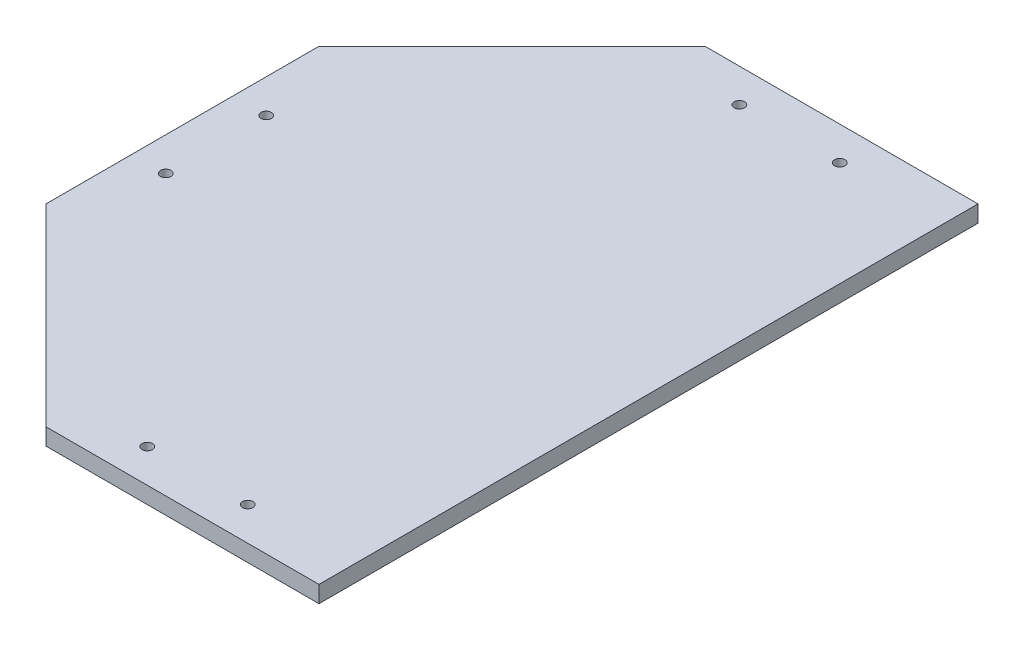
ISO-10303-21;
HEADER;
FILE_DESCRIPTION(('STEP AP214'),'2;1');
FILE_NAME('part.step','',(''),(''),'','','');
FILE_SCHEMA(('AUTOMOTIVE_DESIGN { 1 0 10303 214 1 1 1 1 }'));
ENDSEC;
DATA;
#1=APPLICATION_CONTEXT('core data for automotive mechanical design processes');
#2=APPLICATION_PROTOCOL_DEFINITION('international standard','automotive_design',2000,#1);
#3=PRODUCT_CONTEXT('',#1,'mechanical');
#4=PRODUCT('Part','Part','',(#3));
#5=PRODUCT_RELATED_PRODUCT_CATEGORY('part','',(#4));
#6=PRODUCT_DEFINITION_FORMATION('','',#4);
#7=PRODUCT_DEFINITION_CONTEXT('part definition',#1,'design');
#8=PRODUCT_DEFINITION('design','',#6,#7);
#9=PRODUCT_DEFINITION_SHAPE('','',#8);
#10=(LENGTH_UNIT() NAMED_UNIT(*) SI_UNIT(.MILLI.,.METRE.));
#11=(NAMED_UNIT(*) PLANE_ANGLE_UNIT() SI_UNIT($,.RADIAN.));
#12=(NAMED_UNIT(*) SI_UNIT($,.STERADIAN.) SOLID_ANGLE_UNIT());
#13=UNCERTAINTY_MEASURE_WITH_UNIT(LENGTH_MEASURE(1.E-05),#10,'distance_accuracy_value','');
#14=(GEOMETRIC_REPRESENTATION_CONTEXT(3) GLOBAL_UNCERTAINTY_ASSIGNED_CONTEXT((#13)) GLOBAL_UNIT_ASSIGNED_CONTEXT((#10,
#11,#12)) REPRESENTATION_CONTEXT('',''));
#15=CARTESIAN_POINT('',(0.,0.,0.));
#16=DIRECTION('',(0.,0.,1.));
#17=DIRECTION('',(1.,0.,0.));
#18=AXIS2_PLACEMENT_3D('',#15,#16,#17);
#19=CARTESIAN_POINT('',(51.7766952966369,6.35,-125.));
#20=DIRECTION('',(0.,0.,1.));
#21=DIRECTION('',(1.,0.,0.));
#22=AXIS2_PLACEMENT_3D('',#19,#20,#21);
#23=PLANE('',#22);
#24=DIRECTION('',(-1.,0.,0.));
#25=VECTOR('',#24,1.);
#26=CARTESIAN_POINT('',(51.7766952966369,0.,-125.));
#27=LINE('',#26,#25);
#28=CARTESIAN_POINT('',(51.7766952966369,0.,-125.));
#29=VERTEX_POINT('',#28);
#30=CARTESIAN_POINT('',(-51.7766952966369,0.,-125.));
#31=VERTEX_POINT('',#30);
#32=EDGE_CURVE('E121',#29,#31,#27,.T.);
#33=ORIENTED_EDGE('',*,*,#32,.T.);
#34=DIRECTION('',(0.,-1.,0.));
#35=VECTOR('',#34,1.);
#36=CARTESIAN_POINT('',(-51.7766952966369,6.35,-125.));
#37=LINE('',#36,#35);
#38=CARTESIAN_POINT('',(-51.7766952966369,6.35,-125.));
#39=VERTEX_POINT('',#38);
#40=EDGE_CURVE('E117',#39,#31,#37,.T.);
#41=ORIENTED_EDGE('',*,*,#40,.F.);
#42=DIRECTION('',(-1.,0.,0.));
#43=VECTOR('',#42,1.);
#44=CARTESIAN_POINT('',(51.7766952966369,6.35,-125.));
#45=LINE('',#44,#43);
#46=CARTESIAN_POINT('',(51.7766952966369,6.35,-125.));
#47=VERTEX_POINT('',#46);
#48=EDGE_CURVE('E83',#47,#39,#45,.T.);
#49=ORIENTED_EDGE('',*,*,#48,.F.);
#50=DIRECTION('',(0.,-1.,0.));
#51=VECTOR('',#50,1.);
#52=CARTESIAN_POINT('',(51.7766952966369,6.35,-125.));
#53=LINE('',#52,#51);
#54=EDGE_CURVE('E41',#47,#29,#53,.T.);
#55=ORIENTED_EDGE('',*,*,#54,.T.);
#56=EDGE_LOOP('',(#33,#41,#49,#55));
#57=FACE_BOUND('',#56,.T.);
#58=ADVANCED_FACE('F33',(#57),#23,.F.);
#59=CARTESIAN_POINT('',(-51.7766952966369,6.35,-125.));
#60=DIRECTION('',(0.707106781186547,0.,0.707106781186548));
#61=DIRECTION('',(0.707106781186548,0.,-0.707106781186547));
#62=AXIS2_PLACEMENT_3D('',#59,#60,#61);
#63=PLANE('',#62);
#64=DIRECTION('',(-0.707106781186548,0.,0.707106781186547));
#65=VECTOR('',#64,1.);
#66=CARTESIAN_POINT('',(-51.7766952966369,0.,-125.));
#67=LINE('',#66,#65);
#68=CARTESIAN_POINT('',(-125.,0.,-51.7766952966369));
#69=VERTEX_POINT('',#68);
#70=EDGE_CURVE('E126',#31,#69,#67,.T.);
#71=ORIENTED_EDGE('',*,*,#70,.T.);
#72=DIRECTION('',(0.,-1.,0.));
#73=VECTOR('',#72,1.);
#74=CARTESIAN_POINT('',(-125.,6.35,-51.7766952966369));
#75=LINE('',#74,#73);
#76=CARTESIAN_POINT('',(-125.,6.35,-51.7766952966369));
#77=VERTEX_POINT('',#76);
#78=EDGE_CURVE('E114',#77,#69,#75,.T.);
#79=ORIENTED_EDGE('',*,*,#78,.F.);
#80=DIRECTION('',(-0.707106781186548,0.,0.707106781186547));
#81=VECTOR('',#80,1.);
#82=CARTESIAN_POINT('',(-51.7766952966369,6.35,-125.));
#83=LINE('',#82,#81);
#84=EDGE_CURVE('E136',#39,#77,#83,.T.);
#85=ORIENTED_EDGE('',*,*,#84,.F.);
#86=ORIENTED_EDGE('',*,*,#40,.T.);
#87=EDGE_LOOP('',(#71,#79,#85,#86));
#88=FACE_BOUND('',#87,.T.);
#89=ADVANCED_FACE('F156',(#88),#63,.F.);
#90=CARTESIAN_POINT('',(-125.,6.35,-51.7766952966369));
#91=DIRECTION('',(1.,0.,0.));
#92=DIRECTION('',(0.,0.,-1.));
#93=AXIS2_PLACEMENT_3D('',#90,#91,#92);
#94=PLANE('',#93);
#95=DIRECTION('',(0.,0.,1.));
#96=VECTOR('',#95,1.);
#97=CARTESIAN_POINT('',(-125.,0.,-51.7766952966369));
#98=LINE('',#97,#96);
#99=CARTESIAN_POINT('',(-125.,0.,51.7766952966369));
#100=VERTEX_POINT('',#99);
#101=EDGE_CURVE('E129',#69,#100,#98,.T.);
#102=ORIENTED_EDGE('',*,*,#101,.T.);
#103=DIRECTION('',(0.,-1.,0.));
#104=VECTOR('',#103,1.);
#105=CARTESIAN_POINT('',(-125.,6.35,51.7766952966369));
#106=LINE('',#105,#104);
#107=CARTESIAN_POINT('',(-125.,6.35,51.7766952966369));
#108=VERTEX_POINT('',#107);
#109=EDGE_CURVE('E108',#108,#100,#106,.T.);
#110=ORIENTED_EDGE('',*,*,#109,.F.);
#111=DIRECTION('',(0.,0.,1.));
#112=VECTOR('',#111,1.);
#113=CARTESIAN_POINT('',(-125.,6.35,-51.7766952966369));
#114=LINE('',#113,#112);
#115=EDGE_CURVE('E138',#77,#108,#114,.T.);
#116=ORIENTED_EDGE('',*,*,#115,.F.);
#117=ORIENTED_EDGE('',*,*,#78,.T.);
#118=EDGE_LOOP('',(#102,#110,#116,#117));
#119=FACE_BOUND('',#118,.T.);
#120=ADVANCED_FACE('F147',(#119),#94,.F.);
#121=CARTESIAN_POINT('',(-125.,6.35,51.7766952966369));
#122=DIRECTION('',(0.707106781186548,0.,-0.707106781186548));
#123=DIRECTION('',(-0.707106781186548,0.,-0.707106781186548));
#124=AXIS2_PLACEMENT_3D('',#121,#122,#123);
#125=PLANE('',#124);
#126=DIRECTION('',(0.707106781186547,0.,0.707106781186547));
#127=VECTOR('',#126,1.);
#128=CARTESIAN_POINT('',(-125.,0.,51.7766952966369));
#129=LINE('',#128,#127);
#130=CARTESIAN_POINT('',(-51.7766952966368,0.,125.));
#131=VERTEX_POINT('',#130);
#132=EDGE_CURVE('E69',#100,#131,#129,.T.);
#133=ORIENTED_EDGE('',*,*,#132,.T.);
#134=DIRECTION('',(0.,-1.,0.));
#135=VECTOR('',#134,1.);
#136=CARTESIAN_POINT('',(-51.7766952966368,6.35,125.));
#137=LINE('',#136,#135);
#138=CARTESIAN_POINT('',(-51.7766952966368,6.35,125.));
#139=VERTEX_POINT('',#138);
#140=EDGE_CURVE('E106',#139,#131,#137,.T.);
#141=ORIENTED_EDGE('',*,*,#140,.F.);
#142=DIRECTION('',(0.707106781186547,0.,0.707106781186547));
#143=VECTOR('',#142,1.);
#144=CARTESIAN_POINT('',(-125.,6.35,51.7766952966369));
#145=LINE('',#144,#143);
#146=EDGE_CURVE('E49',#108,#139,#145,.T.);
#147=ORIENTED_EDGE('',*,*,#146,.F.);
#148=ORIENTED_EDGE('',*,*,#109,.T.);
#149=EDGE_LOOP('',(#133,#141,#147,#148));
#150=FACE_BOUND('',#149,.T.);
#151=ADVANCED_FACE('F148',(#150),#125,.F.);
#152=CARTESIAN_POINT('',(-51.7766952966368,6.35,125.));
#153=DIRECTION('',(0.,0.,-1.));
#154=DIRECTION('',(-1.,0.,0.));
#155=AXIS2_PLACEMENT_3D('',#152,#153,#154);
#156=PLANE('',#155);
#157=DIRECTION('',(1.,0.,0.));
#158=VECTOR('',#157,1.);
#159=CARTESIAN_POINT('',(-51.7766952966368,0.,125.));
#160=LINE('',#159,#158);
#161=CARTESIAN_POINT('',(51.7766952966369,0.,125.));
#162=VERTEX_POINT('',#161);
#163=EDGE_CURVE('E105',#131,#162,#160,.T.);
#164=ORIENTED_EDGE('',*,*,#163,.T.);
#165=DIRECTION('',(0.,-1.,0.));
#166=VECTOR('',#165,1.);
#167=CARTESIAN_POINT('',(51.7766952966369,6.35,125.));
#168=LINE('',#167,#166);
#169=CARTESIAN_POINT('',(51.7766952966369,6.35,125.));
#170=VERTEX_POINT('',#169);
#171=EDGE_CURVE('E77',#170,#162,#168,.T.);
#172=ORIENTED_EDGE('',*,*,#171,.F.);
#173=DIRECTION('',(1.,0.,0.));
#174=VECTOR('',#173,1.);
#175=CARTESIAN_POINT('',(-51.7766952966368,6.35,125.));
#176=LINE('',#175,#174);
#177=EDGE_CURVE('E97',#139,#170,#176,.T.);
#178=ORIENTED_EDGE('',*,*,#177,.F.);
#179=ORIENTED_EDGE('',*,*,#140,.T.);
#180=EDGE_LOOP('',(#164,#172,#178,#179));
#181=FACE_BOUND('',#180,.T.);
#182=ADVANCED_FACE('F103',(#181),#156,.F.);
#183=CARTESIAN_POINT('',(0.,6.35,0.));
#184=DIRECTION('',(0.,1.,0.));
#185=DIRECTION('',(0.,0.,1.));
#186=AXIS2_PLACEMENT_3D('',#183,#184,#185);
#187=PLANE('',#186);
#188=DIRECTION('',(0.,0.,1.));
#189=VECTOR('',#188,1.);
#190=CARTESIAN_POINT('',(51.7766952966369,6.35,-125.));
#191=LINE('',#190,#189);
#192=EDGE_CURVE('E91',#47,#170,#191,.T.);
#193=ORIENTED_EDGE('',*,*,#192,.F.);
#194=ORIENTED_EDGE('',*,*,#48,.T.);
#195=ORIENTED_EDGE('',*,*,#84,.T.);
#196=ORIENTED_EDGE('',*,*,#115,.T.);
#197=ORIENTED_EDGE('',*,*,#146,.T.);
#198=ORIENTED_EDGE('',*,*,#177,.T.);
#199=EDGE_LOOP('',(#193,#194,#195,#196,#197,#198));
#200=FACE_BOUND('',#199,.T.);
#201=CARTESIAN_POINT('',(-112.3,6.35,-19.05));
#202=DIRECTION('',(0.,1.,0.));
#203=DIRECTION('',(0.,0.,1.));
#204=AXIS2_PLACEMENT_3D('',#201,#202,#203);
#205=CIRCLE('',#204,1.99499999999999);
#206=CARTESIAN_POINT('',(-112.3,6.35,-17.055));
#207=VERTEX_POINT('',#206);
#208=EDGE_CURVE('E313',#207,#207,#205,.T.);
#209=ORIENTED_EDGE('',*,*,#208,.F.);
#210=EDGE_LOOP('',(#209));
#211=FACE_BOUND('',#210,.T.);
#212=CARTESIAN_POINT('',(-112.3,6.35,19.05));
#213=DIRECTION('',(0.,1.,0.));
#214=DIRECTION('',(0.,0.,1.));
#215=AXIS2_PLACEMENT_3D('',#212,#213,#214);
#216=CIRCLE('',#215,1.99499999999999);
#217=CARTESIAN_POINT('',(-112.3,6.35,21.045));
#218=VERTEX_POINT('',#217);
#219=EDGE_CURVE('E94',#218,#218,#216,.T.);
#220=ORIENTED_EDGE('',*,*,#219,.F.);
#221=EDGE_LOOP('',(#220));
#222=FACE_BOUND('',#221,.T.);
#223=CARTESIAN_POINT('',(-26.05,6.35,-112.3));
#224=DIRECTION('',(0.,1.,0.));
#225=DIRECTION('',(0.,0.,-1.));
#226=AXIS2_PLACEMENT_3D('',#223,#224,#225);
#227=CIRCLE('',#226,1.99499999999999);
#228=CARTESIAN_POINT('',(-26.05,6.35,-114.295));
#229=VERTEX_POINT('',#228);
#230=EDGE_CURVE('E309',#229,#229,#227,.T.);
#231=ORIENTED_EDGE('',*,*,#230,.F.);
#232=EDGE_LOOP('',(#231));
#233=FACE_BOUND('',#232,.T.);
#234=CARTESIAN_POINT('',(12.05,6.35,-112.3));
#235=DIRECTION('',(0.,1.,0.));
#236=DIRECTION('',(0.,0.,-1.));
#237=AXIS2_PLACEMENT_3D('',#234,#235,#236);
#238=CIRCLE('',#237,1.995);
#239=CARTESIAN_POINT('',(12.05,6.35,-114.295));
#240=VERTEX_POINT('',#239);
#241=EDGE_CURVE('E305',#240,#240,#238,.T.);
#242=ORIENTED_EDGE('',*,*,#241,.F.);
#243=EDGE_LOOP('',(#242));
#244=FACE_BOUND('',#243,.T.);
#245=CARTESIAN_POINT('',(12.05,6.35,112.3));
#246=DIRECTION('',(0.,1.,0.));
#247=DIRECTION('',(0.,0.,1.));
#248=AXIS2_PLACEMENT_3D('',#245,#246,#247);
#249=CIRCLE('',#248,1.995);
#250=CARTESIAN_POINT('',(12.05,6.35,114.295));
#251=VERTEX_POINT('',#250);
#252=EDGE_CURVE('E297',#251,#251,#249,.T.);
#253=ORIENTED_EDGE('',*,*,#252,.F.);
#254=EDGE_LOOP('',(#253));
#255=FACE_BOUND('',#254,.T.);
#256=CARTESIAN_POINT('',(-26.05,6.35,112.3));
#257=DIRECTION('',(0.,1.,0.));
#258=DIRECTION('',(0.,0.,1.));
#259=AXIS2_PLACEMENT_3D('',#256,#257,#258);
#260=CIRCLE('',#259,1.995);
#261=CARTESIAN_POINT('',(-26.05,6.35,114.295));
#262=VERTEX_POINT('',#261);
#263=EDGE_CURVE('E132',#262,#262,#260,.T.);
#264=ORIENTED_EDGE('',*,*,#263,.F.);
#265=EDGE_LOOP('',(#264));
#266=FACE_BOUND('',#265,.T.);
#267=ADVANCED_FACE('F98',(#200,#211,#222,#233,#244,#255,#266),#187,.T.);
#268=CARTESIAN_POINT('',(0.,0.,0.));
#269=DIRECTION('',(0.,1.,0.));
#270=DIRECTION('',(0.,0.,1.));
#271=AXIS2_PLACEMENT_3D('',#268,#269,#270);
#272=PLANE('',#271);
#273=CARTESIAN_POINT('',(-112.3,0.,-19.05));
#274=DIRECTION('',(0.,1.,0.));
#275=DIRECTION('',(0.,0.,1.));
#276=AXIS2_PLACEMENT_3D('',#273,#274,#275);
#277=CIRCLE('',#276,1.99499999999999);
#278=CARTESIAN_POINT('',(-112.3,0.,-17.055));
#279=VERTEX_POINT('',#278);
#280=EDGE_CURVE('E275',#279,#279,#277,.T.);
#281=ORIENTED_EDGE('',*,*,#280,.T.);
#282=EDGE_LOOP('',(#281));
#283=FACE_BOUND('',#282,.T.);
#284=CARTESIAN_POINT('',(-112.3,0.,19.05));
#285=DIRECTION('',(0.,1.,0.));
#286=DIRECTION('',(0.,0.,1.));
#287=AXIS2_PLACEMENT_3D('',#284,#285,#286);
#288=CIRCLE('',#287,1.99499999999999);
#289=CARTESIAN_POINT('',(-112.3,0.,21.045));
#290=VERTEX_POINT('',#289);
#291=EDGE_CURVE('E279',#290,#290,#288,.T.);
#292=ORIENTED_EDGE('',*,*,#291,.T.);
#293=EDGE_LOOP('',(#292));
#294=FACE_BOUND('',#293,.T.);
#295=CARTESIAN_POINT('',(-26.05,0.,-112.3));
#296=DIRECTION('',(0.,1.,0.));
#297=DIRECTION('',(0.,0.,-1.));
#298=AXIS2_PLACEMENT_3D('',#295,#296,#297);
#299=CIRCLE('',#298,1.99499999999999);
#300=CARTESIAN_POINT('',(-26.05,0.,-114.295));
#301=VERTEX_POINT('',#300);
#302=EDGE_CURVE('E283',#301,#301,#299,.T.);
#303=ORIENTED_EDGE('',*,*,#302,.T.);
#304=EDGE_LOOP('',(#303));
#305=FACE_BOUND('',#304,.T.);
#306=CARTESIAN_POINT('',(12.05,0.,-112.3));
#307=DIRECTION('',(0.,1.,0.));
#308=DIRECTION('',(0.,0.,-1.));
#309=AXIS2_PLACEMENT_3D('',#306,#307,#308);
#310=CIRCLE('',#309,1.995);
#311=CARTESIAN_POINT('',(12.05,0.,-114.295));
#312=VERTEX_POINT('',#311);
#313=EDGE_CURVE('E287',#312,#312,#310,.T.);
#314=ORIENTED_EDGE('',*,*,#313,.T.);
#315=EDGE_LOOP('',(#314));
#316=FACE_BOUND('',#315,.T.);
#317=CARTESIAN_POINT('',(12.05,0.,112.3));
#318=DIRECTION('',(0.,1.,0.));
#319=DIRECTION('',(0.,0.,1.));
#320=AXIS2_PLACEMENT_3D('',#317,#318,#319);
#321=CIRCLE('',#320,1.995);
#322=CARTESIAN_POINT('',(12.05,0.,114.295));
#323=VERTEX_POINT('',#322);
#324=EDGE_CURVE('E291',#323,#323,#321,.T.);
#325=ORIENTED_EDGE('',*,*,#324,.T.);
#326=EDGE_LOOP('',(#325));
#327=FACE_BOUND('',#326,.T.);
#328=CARTESIAN_POINT('',(-26.05,0.,112.3));
#329=DIRECTION('',(0.,1.,0.));
#330=DIRECTION('',(0.,0.,1.));
#331=AXIS2_PLACEMENT_3D('',#328,#329,#330);
#332=CIRCLE('',#331,1.995);
#333=CARTESIAN_POINT('',(-26.05,0.,114.295));
#334=VERTEX_POINT('',#333);
#335=EDGE_CURVE('E127',#334,#334,#332,.T.);
#336=ORIENTED_EDGE('',*,*,#335,.T.);
#337=EDGE_LOOP('',(#336));
#338=FACE_BOUND('',#337,.T.);
#339=ORIENTED_EDGE('',*,*,#32,.F.);
#340=DIRECTION('',(0.,0.,1.));
#341=VECTOR('',#340,1.);
#342=CARTESIAN_POINT('',(51.7766952966369,0.,0.));
#343=LINE('',#342,#341);
#344=EDGE_CURVE('E11',#29,#162,#343,.T.);
#345=ORIENTED_EDGE('',*,*,#344,.T.);
#346=ORIENTED_EDGE('',*,*,#163,.F.);
#347=ORIENTED_EDGE('',*,*,#132,.F.);
#348=ORIENTED_EDGE('',*,*,#101,.F.);
#349=ORIENTED_EDGE('',*,*,#70,.F.);
#350=EDGE_LOOP('',(#339,#345,#346,#347,#348,#349));
#351=FACE_BOUND('',#350,.T.);
#352=ADVANCED_FACE('F124',(#283,#294,#305,#316,#327,#338,#351),#272,.F.);
#353=CARTESIAN_POINT('',(-26.05,0.,112.3));
#354=DIRECTION('',(0.,1.,0.));
#355=DIRECTION('',(0.,0.,1.));
#356=AXIS2_PLACEMENT_3D('',#353,#354,#355);
#357=CYLINDRICAL_SURFACE('',#356,1.995);
#358=ORIENTED_EDGE('',*,*,#335,.F.);
#359=EDGE_LOOP('',(#358));
#360=FACE_BOUND('',#359,.T.);
#361=ORIENTED_EDGE('',*,*,#263,.T.);
#362=EDGE_LOOP('',(#361));
#363=FACE_BOUND('',#362,.T.);
#364=ADVANCED_FACE('F179',(#360,#363),#357,.F.);
#365=CARTESIAN_POINT('',(12.05,0.,112.3));
#366=DIRECTION('',(0.,1.,0.));
#367=DIRECTION('',(0.,0.,1.));
#368=AXIS2_PLACEMENT_3D('',#365,#366,#367);
#369=CYLINDRICAL_SURFACE('',#368,1.995);
#370=ORIENTED_EDGE('',*,*,#324,.F.);
#371=EDGE_LOOP('',(#370));
#372=FACE_BOUND('',#371,.T.);
#373=ORIENTED_EDGE('',*,*,#252,.T.);
#374=EDGE_LOOP('',(#373));
#375=FACE_BOUND('',#374,.T.);
#376=ADVANCED_FACE('F184',(#372,#375),#369,.F.);
#377=CARTESIAN_POINT('',(12.05,0.,-112.3));
#378=DIRECTION('',(0.,1.,0.));
#379=DIRECTION('',(0.,0.,1.));
#380=AXIS2_PLACEMENT_3D('',#377,#378,#379);
#381=CYLINDRICAL_SURFACE('',#380,1.995);
#382=ORIENTED_EDGE('',*,*,#313,.F.);
#383=EDGE_LOOP('',(#382));
#384=FACE_BOUND('',#383,.T.);
#385=ORIENTED_EDGE('',*,*,#241,.T.);
#386=EDGE_LOOP('',(#385));
#387=FACE_BOUND('',#386,.T.);
#388=ADVANCED_FACE('F196',(#384,#387),#381,.F.);
#389=CARTESIAN_POINT('',(-26.05,0.,-112.3));
#390=DIRECTION('',(0.,1.,0.));
#391=DIRECTION('',(0.,0.,1.));
#392=AXIS2_PLACEMENT_3D('',#389,#390,#391);
#393=CYLINDRICAL_SURFACE('',#392,1.99499999999999);
#394=ORIENTED_EDGE('',*,*,#302,.F.);
#395=EDGE_LOOP('',(#394));
#396=FACE_BOUND('',#395,.T.);
#397=ORIENTED_EDGE('',*,*,#230,.T.);
#398=EDGE_LOOP('',(#397));
#399=FACE_BOUND('',#398,.T.);
#400=ADVANCED_FACE('F206',(#396,#399),#393,.F.);
#401=CARTESIAN_POINT('',(-112.3,0.,19.05));
#402=DIRECTION('',(0.,1.,0.));
#403=DIRECTION('',(0.,0.,1.));
#404=AXIS2_PLACEMENT_3D('',#401,#402,#403);
#405=CYLINDRICAL_SURFACE('',#404,1.99499999999999);
#406=ORIENTED_EDGE('',*,*,#291,.F.);
#407=EDGE_LOOP('',(#406));
#408=FACE_BOUND('',#407,.T.);
#409=ORIENTED_EDGE('',*,*,#219,.T.);
#410=EDGE_LOOP('',(#409));
#411=FACE_BOUND('',#410,.T.);
#412=ADVANCED_FACE('F216',(#408,#411),#405,.F.);
#413=CARTESIAN_POINT('',(-112.3,0.,-19.05));
#414=DIRECTION('',(0.,1.,0.));
#415=DIRECTION('',(0.,0.,1.));
#416=AXIS2_PLACEMENT_3D('',#413,#414,#415);
#417=CYLINDRICAL_SURFACE('',#416,1.99499999999999);
#418=ORIENTED_EDGE('',*,*,#280,.F.);
#419=EDGE_LOOP('',(#418));
#420=FACE_BOUND('',#419,.T.);
#421=ORIENTED_EDGE('',*,*,#208,.T.);
#422=EDGE_LOOP('',(#421));
#423=FACE_BOUND('',#422,.T.);
#424=ADVANCED_FACE('F226',(#420,#423),#417,.F.);
#425=CARTESIAN_POINT('',(51.7766952966369,-3.65,-125.));
#426=DIRECTION('',(-1.,0.,0.));
#427=DIRECTION('',(0.,0.,1.));
#428=AXIS2_PLACEMENT_3D('',#425,#426,#427);
#429=PLANE('',#428);
#430=ORIENTED_EDGE('',*,*,#54,.F.);
#431=ORIENTED_EDGE('',*,*,#192,.T.);
#432=ORIENTED_EDGE('',*,*,#171,.T.);
#433=ORIENTED_EDGE('',*,*,#344,.F.);
#434=EDGE_LOOP('',(#430,#431,#432,#433));
#435=FACE_BOUND('',#434,.T.);
#436=ADVANCED_FACE('F92',(#435),#429,.F.);
#437=CLOSED_SHELL('',(#58,#89,#120,#151,#182,#267,#352,#364,#376,#388,#400,#412,#424,#436));
#438=MANIFOLD_SOLID_BREP('B2',#437);
#439=ADVANCED_BREP_SHAPE_REPRESENTATION('',(#18,#438),#14);
#440=SHAPE_DEFINITION_REPRESENTATION(#9,#439);
ENDSEC;
END-ISO-10303-21;
